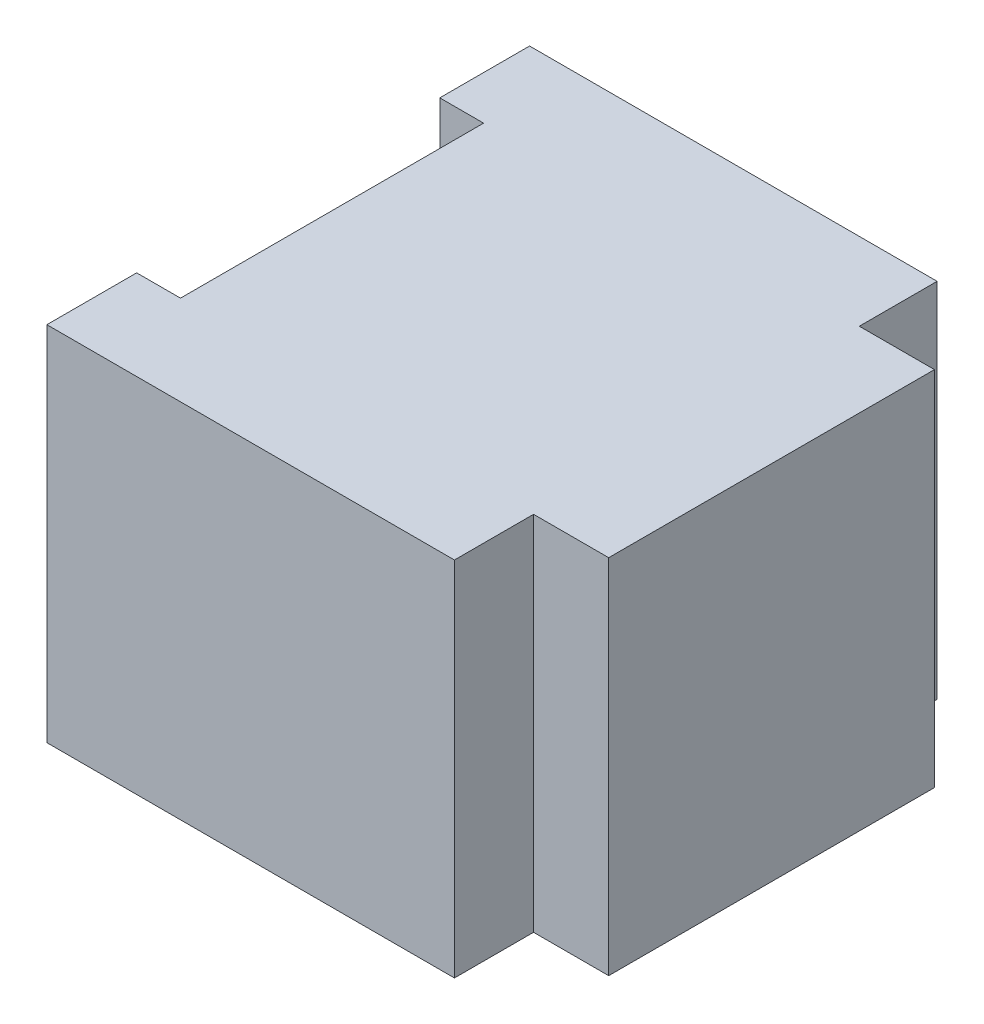
ISO-10303-21;
HEADER;
FILE_DESCRIPTION(('STEP AP214'),'2;1');
FILE_NAME('part.step','',(''),(''),'','','');
FILE_SCHEMA(('AUTOMOTIVE_DESIGN { 1 0 10303 214 1 1 1 1 }'));
ENDSEC;
DATA;
#1=APPLICATION_CONTEXT('core data for automotive mechanical design processes');
#2=APPLICATION_PROTOCOL_DEFINITION('international standard','automotive_design',2000,#1);
#3=PRODUCT_CONTEXT('',#1,'mechanical');
#4=PRODUCT('Part','Part','',(#3));
#5=PRODUCT_RELATED_PRODUCT_CATEGORY('part','',(#4));
#6=PRODUCT_DEFINITION_FORMATION('','',#4);
#7=PRODUCT_DEFINITION_CONTEXT('part definition',#1,'design');
#8=PRODUCT_DEFINITION('design','',#6,#7);
#9=PRODUCT_DEFINITION_SHAPE('','',#8);
#10=(LENGTH_UNIT() NAMED_UNIT(*) SI_UNIT(.MILLI.,.METRE.));
#11=(NAMED_UNIT(*) PLANE_ANGLE_UNIT() SI_UNIT($,.RADIAN.));
#12=(NAMED_UNIT(*) SI_UNIT($,.STERADIAN.) SOLID_ANGLE_UNIT());
#13=UNCERTAINTY_MEASURE_WITH_UNIT(LENGTH_MEASURE(1.E-05),#10,'distance_accuracy_value','');
#14=(GEOMETRIC_REPRESENTATION_CONTEXT(3) GLOBAL_UNCERTAINTY_ASSIGNED_CONTEXT((#13)) GLOBAL_UNIT_ASSIGNED_CONTEXT((#10,
#11,#12)) REPRESENTATION_CONTEXT('',''));
#15=CARTESIAN_POINT('',(0.,0.,0.));
#16=DIRECTION('',(0.,0.,1.));
#17=DIRECTION('',(1.,0.,0.));
#18=AXIS2_PLACEMENT_3D('',#15,#16,#17);
#19=CARTESIAN_POINT('',(-40.,60.,40.));
#20=DIRECTION('',(1.,0.,0.));
#21=DIRECTION('',(0.,0.,-1.));
#22=AXIS2_PLACEMENT_3D('',#19,#20,#21);
#23=PLANE('',#22);
#24=DIRECTION('',(0.,0.,1.));
#25=VECTOR('',#24,1.);
#26=CARTESIAN_POINT('',(-40.,0.,40.));
#27=LINE('',#26,#25);
#28=CARTESIAN_POINT('',(-40.,0.,-40.));
#29=VERTEX_POINT('',#28);
#30=CARTESIAN_POINT('',(-40.,0.,-25.1186473822366));
#31=VERTEX_POINT('',#30);
#32=EDGE_CURVE('E143',#29,#31,#27,.T.);
#33=ORIENTED_EDGE('',*,*,#32,.T.);
#34=DIRECTION('',(0.,1.,0.));
#35=VECTOR('',#34,1.);
#36=CARTESIAN_POINT('',(-40.,0.,-25.1186473822366));
#37=LINE('',#36,#35);
#38=CARTESIAN_POINT('',(-40.,60.,-25.1186473822366));
#39=VERTEX_POINT('',#38);
#40=EDGE_CURVE('E149',#31,#39,#37,.T.);
#41=ORIENTED_EDGE('',*,*,#40,.T.);
#42=DIRECTION('',(0.,0.,1.));
#43=VECTOR('',#42,1.);
#44=CARTESIAN_POINT('',(-40.,60.,40.));
#45=LINE('',#44,#43);
#46=CARTESIAN_POINT('',(-40.,60.,-40.));
#47=VERTEX_POINT('',#46);
#48=EDGE_CURVE('E163',#47,#39,#45,.T.);
#49=ORIENTED_EDGE('',*,*,#48,.F.);
#50=DIRECTION('',(0.,-1.,0.));
#51=VECTOR('',#50,1.);
#52=CARTESIAN_POINT('',(-40.,60.,-40.));
#53=LINE('',#52,#51);
#54=EDGE_CURVE('E11',#47,#29,#53,.T.);
#55=ORIENTED_EDGE('',*,*,#54,.T.);
#56=EDGE_LOOP('',(#33,#41,#49,#55));
#57=FACE_BOUND('',#56,.T.);
#58=ADVANCED_FACE('F33',(#57),#23,.F.);
#59=CARTESIAN_POINT('',(40.,60.,40.));
#60=DIRECTION('',(-1.,0.,0.));
#61=DIRECTION('',(0.,0.,1.));
#62=AXIS2_PLACEMENT_3D('',#59,#60,#61);
#63=PLANE('',#62);
#64=DIRECTION('',(0.,0.,-1.));
#65=VECTOR('',#64,1.);
#66=CARTESIAN_POINT('',(40.,0.,40.));
#67=LINE('',#66,#65);
#68=CARTESIAN_POINT('',(40.,0.,26.8852335717561));
#69=VERTEX_POINT('',#68);
#70=CARTESIAN_POINT('',(40.,0.,-27.1060568454465));
#71=VERTEX_POINT('',#70);
#72=EDGE_CURVE('E145',#69,#71,#67,.T.);
#73=ORIENTED_EDGE('',*,*,#72,.T.);
#74=DIRECTION('',(0.,1.,0.));
#75=VECTOR('',#74,1.);
#76=CARTESIAN_POINT('',(40.,0.,-27.1060568454465));
#77=LINE('',#76,#75);
#78=CARTESIAN_POINT('',(40.,60.,-27.1060568454465));
#79=VERTEX_POINT('',#78);
#80=EDGE_CURVE('E191',#71,#79,#77,.T.);
#81=ORIENTED_EDGE('',*,*,#80,.T.);
#82=DIRECTION('',(0.,0.,-1.));
#83=VECTOR('',#82,1.);
#84=CARTESIAN_POINT('',(40.,60.,40.));
#85=LINE('',#84,#83);
#86=CARTESIAN_POINT('',(40.,60.,26.8852335717561));
#87=VERTEX_POINT('',#86);
#88=EDGE_CURVE('E155',#87,#79,#85,.T.);
#89=ORIENTED_EDGE('',*,*,#88,.F.);
#90=DIRECTION('',(0.,1.,0.));
#91=VECTOR('',#90,1.);
#92=CARTESIAN_POINT('',(40.,0.,26.8852335717561));
#93=LINE('',#92,#91);
#94=EDGE_CURVE('E198',#69,#87,#93,.T.);
#95=ORIENTED_EDGE('',*,*,#94,.F.);
#96=EDGE_LOOP('',(#73,#81,#89,#95));
#97=FACE_BOUND('',#96,.T.);
#98=ADVANCED_FACE('F35',(#97),#63,.F.);
#99=CARTESIAN_POINT('',(-40.,60.,-40.));
#100=DIRECTION('',(0.,0.,1.));
#101=DIRECTION('',(1.,0.,0.));
#102=AXIS2_PLACEMENT_3D('',#99,#100,#101);
#103=PLANE('',#102);
#104=DIRECTION('',(-1.,0.,0.));
#105=VECTOR('',#104,1.);
#106=CARTESIAN_POINT('',(-40.,60.,-40.));
#107=LINE('',#106,#105);
#108=CARTESIAN_POINT('',(27.5477033928263,60.,-40.));
#109=VERTEX_POINT('',#108);
#110=EDGE_CURVE('E137',#109,#47,#107,.T.);
#111=ORIENTED_EDGE('',*,*,#110,.F.);
#112=DIRECTION('',(0.,1.,0.));
#113=VECTOR('',#112,1.);
#114=CARTESIAN_POINT('',(27.5477033928263,0.,-40.));
#115=LINE('',#114,#113);
#116=CARTESIAN_POINT('',(27.5477033928263,0.,-40.));
#117=VERTEX_POINT('',#116);
#118=EDGE_CURVE('E125',#117,#109,#115,.T.);
#119=ORIENTED_EDGE('',*,*,#118,.F.);
#120=DIRECTION('',(-1.,0.,0.));
#121=VECTOR('',#120,1.);
#122=CARTESIAN_POINT('',(-40.,0.,-40.));
#123=LINE('',#122,#121);
#124=EDGE_CURVE('E136',#117,#29,#123,.T.);
#125=ORIENTED_EDGE('',*,*,#124,.T.);
#126=ORIENTED_EDGE('',*,*,#54,.F.);
#127=EDGE_LOOP('',(#111,#119,#125,#126));
#128=FACE_BOUND('',#127,.T.);
#129=ADVANCED_FACE('F134',(#128),#103,.F.);
#130=CARTESIAN_POINT('',(-40.,60.,25.1186473822362));
#131=VERTEX_POINT('',#130);
#132=CARTESIAN_POINT('',(-40.,60.,40.));
#133=VERTEX_POINT('',#132);
#134=EDGE_CURVE('E167',#131,#133,#45,.T.);
#135=ORIENTED_EDGE('',*,*,#134,.F.);
#136=DIRECTION('',(0.,1.,0.));
#137=VECTOR('',#136,1.);
#138=CARTESIAN_POINT('',(-40.,0.,25.1186473822362));
#139=LINE('',#138,#137);
#140=CARTESIAN_POINT('',(-40.,0.,25.1186473822362));
#141=VERTEX_POINT('',#140);
#142=EDGE_CURVE('E173',#141,#131,#139,.T.);
#143=ORIENTED_EDGE('',*,*,#142,.F.);
#144=CARTESIAN_POINT('',(-40.,0.,40.));
#145=VERTEX_POINT('',#144);
#146=EDGE_CURVE('E144',#141,#145,#27,.T.);
#147=ORIENTED_EDGE('',*,*,#146,.T.);
#148=DIRECTION('',(0.,-1.,0.));
#149=VECTOR('',#148,1.);
#150=CARTESIAN_POINT('',(-40.,60.,40.));
#151=LINE('',#150,#149);
#152=EDGE_CURVE('E41',#133,#145,#151,.T.);
#153=ORIENTED_EDGE('',*,*,#152,.F.);
#154=EDGE_LOOP('',(#135,#143,#147,#153));
#155=FACE_BOUND('',#154,.T.);
#156=ADVANCED_FACE('F235',(#155),#23,.F.);
#157=CARTESIAN_POINT('',(-40.,60.,40.));
#158=DIRECTION('',(0.,0.,-1.));
#159=DIRECTION('',(-1.,0.,0.));
#160=AXIS2_PLACEMENT_3D('',#157,#158,#159);
#161=PLANE('',#160);
#162=DIRECTION('',(1.,0.,0.));
#163=VECTOR('',#162,1.);
#164=CARTESIAN_POINT('',(-40.,0.,40.));
#165=LINE('',#164,#163);
#166=CARTESIAN_POINT('',(27.5477033928263,0.,40.));
#167=VERTEX_POINT('',#166);
#168=EDGE_CURVE('E153',#145,#167,#165,.T.);
#169=ORIENTED_EDGE('',*,*,#168,.T.);
#170=DIRECTION('',(0.,1.,0.));
#171=VECTOR('',#170,1.);
#172=CARTESIAN_POINT('',(27.5477033928263,0.,40.));
#173=LINE('',#172,#171);
#174=CARTESIAN_POINT('',(27.5477033928263,60.,40.));
#175=VERTEX_POINT('',#174);
#176=EDGE_CURVE('E202',#167,#175,#173,.T.);
#177=ORIENTED_EDGE('',*,*,#176,.T.);
#178=DIRECTION('',(1.,0.,0.));
#179=VECTOR('',#178,1.);
#180=CARTESIAN_POINT('',(-40.,60.,40.));
#181=LINE('',#180,#179);
#182=EDGE_CURVE('E157',#133,#175,#181,.T.);
#183=ORIENTED_EDGE('',*,*,#182,.F.);
#184=ORIENTED_EDGE('',*,*,#152,.T.);
#185=EDGE_LOOP('',(#169,#177,#183,#184));
#186=FACE_BOUND('',#185,.T.);
#187=ADVANCED_FACE('F230',(#186),#161,.F.);
#188=CARTESIAN_POINT('',(0.,60.,0.));
#189=DIRECTION('',(0.,-1.,0.));
#190=DIRECTION('',(0.,0.,-1.));
#191=AXIS2_PLACEMENT_3D('',#188,#189,#190);
#192=PLANE('',#191);
#193=ORIENTED_EDGE('',*,*,#88,.T.);
#194=DIRECTION('',(1.,0.,0.));
#195=VECTOR('',#194,1.);
#196=CARTESIAN_POINT('',(40.,60.,-27.1060568454465));
#197=LINE('',#196,#195);
#198=CARTESIAN_POINT('',(27.5477033928263,60.,-27.1060568454465));
#199=VERTEX_POINT('',#198);
#200=EDGE_CURVE('E130',#199,#79,#197,.T.);
#201=ORIENTED_EDGE('',*,*,#200,.F.);
#202=DIRECTION('',(0.,0.,1.));
#203=VECTOR('',#202,1.);
#204=CARTESIAN_POINT('',(27.5477033928263,60.,-40.));
#205=LINE('',#204,#203);
#206=EDGE_CURVE('E205',#109,#199,#205,.T.);
#207=ORIENTED_EDGE('',*,*,#206,.F.);
#208=ORIENTED_EDGE('',*,*,#110,.T.);
#209=ORIENTED_EDGE('',*,*,#48,.T.);
#210=DIRECTION('',(-1.,0.,0.));
#211=VECTOR('',#210,1.);
#212=CARTESIAN_POINT('',(-40.,60.,-25.1186473822366));
#213=LINE('',#212,#211);
#214=CARTESIAN_POINT('',(-32.737050324541,60.,-25.1186473822366));
#215=VERTEX_POINT('',#214);
#216=EDGE_CURVE('E182',#215,#39,#213,.T.);
#217=ORIENTED_EDGE('',*,*,#216,.F.);
#218=DIRECTION('',(0.,0.,-1.));
#219=VECTOR('',#218,1.);
#220=CARTESIAN_POINT('',(-32.737050324541,60.,-25.1186473822366));
#221=LINE('',#220,#219);
#222=CARTESIAN_POINT('',(-32.737050324541,60.,25.1186473822362));
#223=VERTEX_POINT('',#222);
#224=EDGE_CURVE('E185',#223,#215,#221,.T.);
#225=ORIENTED_EDGE('',*,*,#224,.F.);
#226=DIRECTION('',(1.,0.,0.));
#227=VECTOR('',#226,1.);
#228=CARTESIAN_POINT('',(-40.,60.,25.1186473822362));
#229=LINE('',#228,#227);
#230=EDGE_CURVE('E188',#131,#223,#229,.T.);
#231=ORIENTED_EDGE('',*,*,#230,.F.);
#232=ORIENTED_EDGE('',*,*,#134,.T.);
#233=ORIENTED_EDGE('',*,*,#182,.T.);
#234=DIRECTION('',(0.,0.,1.));
#235=VECTOR('',#234,1.);
#236=CARTESIAN_POINT('',(27.5477033928263,60.,40.));
#237=LINE('',#236,#235);
#238=CARTESIAN_POINT('',(27.5477033928263,60.,26.8852335717561));
#239=VERTEX_POINT('',#238);
#240=EDGE_CURVE('E206',#239,#175,#237,.T.);
#241=ORIENTED_EDGE('',*,*,#240,.F.);
#242=DIRECTION('',(-1.,0.,0.));
#243=VECTOR('',#242,1.);
#244=CARTESIAN_POINT('',(40.,60.,26.8852335717561));
#245=LINE('',#244,#243);
#246=EDGE_CURVE('E209',#87,#239,#245,.T.);
#247=ORIENTED_EDGE('',*,*,#246,.F.);
#248=EDGE_LOOP('',(#193,#201,#207,#208,#209,#217,#225,#231,#232,#233,#241,#247));
#249=FACE_BOUND('',#248,.T.);
#250=ADVANCED_FACE('F227',(#249),#192,.F.);
#251=CARTESIAN_POINT('',(0.,0.,0.));
#252=DIRECTION('',(0.,-1.,0.));
#253=DIRECTION('',(0.,0.,-1.));
#254=AXIS2_PLACEMENT_3D('',#251,#252,#253);
#255=PLANE('',#254);
#256=DIRECTION('',(1.,0.,0.));
#257=VECTOR('',#256,1.);
#258=CARTESIAN_POINT('',(40.,0.,-27.1060568454465));
#259=LINE('',#258,#257);
#260=CARTESIAN_POINT('',(27.5477033928263,0.,-27.1060568454465));
#261=VERTEX_POINT('',#260);
#262=EDGE_CURVE('E48',#261,#71,#259,.T.);
#263=ORIENTED_EDGE('',*,*,#262,.T.);
#264=ORIENTED_EDGE('',*,*,#72,.F.);
#265=DIRECTION('',(-1.,0.,0.));
#266=VECTOR('',#265,1.);
#267=CARTESIAN_POINT('',(40.,0.,26.8852335717561));
#268=LINE('',#267,#266);
#269=CARTESIAN_POINT('',(27.5477033928263,0.,26.8852335717561));
#270=VERTEX_POINT('',#269);
#271=EDGE_CURVE('E208',#69,#270,#268,.T.);
#272=ORIENTED_EDGE('',*,*,#271,.T.);
#273=DIRECTION('',(0.,0.,1.));
#274=VECTOR('',#273,1.);
#275=CARTESIAN_POINT('',(27.5477033928263,0.,40.));
#276=LINE('',#275,#274);
#277=EDGE_CURVE('E56',#270,#167,#276,.T.);
#278=ORIENTED_EDGE('',*,*,#277,.T.);
#279=ORIENTED_EDGE('',*,*,#168,.F.);
#280=ORIENTED_EDGE('',*,*,#146,.F.);
#281=DIRECTION('',(1.,0.,0.));
#282=VECTOR('',#281,1.);
#283=CARTESIAN_POINT('',(-40.,0.,25.1186473822362));
#284=LINE('',#283,#282);
#285=CARTESIAN_POINT('',(-32.737050324541,0.,25.1186473822362));
#286=VERTEX_POINT('',#285);
#287=EDGE_CURVE('E184',#141,#286,#284,.T.);
#288=ORIENTED_EDGE('',*,*,#287,.T.);
#289=DIRECTION('',(0.,0.,-1.));
#290=VECTOR('',#289,1.);
#291=CARTESIAN_POINT('',(-32.737050324541,0.,-25.1186473822366));
#292=LINE('',#291,#290);
#293=CARTESIAN_POINT('',(-32.737050324541,0.,-25.1186473822366));
#294=VERTEX_POINT('',#293);
#295=EDGE_CURVE('E193',#286,#294,#292,.T.);
#296=ORIENTED_EDGE('',*,*,#295,.T.);
#297=DIRECTION('',(-1.,0.,0.));
#298=VECTOR('',#297,1.);
#299=CARTESIAN_POINT('',(-40.,0.,-25.1186473822366));
#300=LINE('',#299,#298);
#301=EDGE_CURVE('E176',#294,#31,#300,.T.);
#302=ORIENTED_EDGE('',*,*,#301,.T.);
#303=ORIENTED_EDGE('',*,*,#32,.F.);
#304=ORIENTED_EDGE('',*,*,#124,.F.);
#305=DIRECTION('',(0.,0.,1.));
#306=VECTOR('',#305,1.);
#307=CARTESIAN_POINT('',(27.5477033928263,0.,-40.));
#308=LINE('',#307,#306);
#309=EDGE_CURVE('E121',#117,#261,#308,.T.);
#310=ORIENTED_EDGE('',*,*,#309,.T.);
#311=EDGE_LOOP('',(#263,#264,#272,#278,#279,#280,#288,#296,#302,#303,#304,#310));
#312=FACE_BOUND('',#311,.T.);
#313=ADVANCED_FACE('F140',(#312),#255,.T.);
#314=CARTESIAN_POINT('',(-40.,0.,-25.1186473822366));
#315=DIRECTION('',(0.,0.,-1.));
#316=DIRECTION('',(-1.,0.,0.));
#317=AXIS2_PLACEMENT_3D('',#314,#315,#316);
#318=PLANE('',#317);
#319=ORIENTED_EDGE('',*,*,#216,.T.);
#320=ORIENTED_EDGE('',*,*,#40,.F.);
#321=ORIENTED_EDGE('',*,*,#301,.F.);
#322=DIRECTION('',(0.,1.,0.));
#323=VECTOR('',#322,1.);
#324=CARTESIAN_POINT('',(-32.737050324541,0.,-25.1186473822366));
#325=LINE('',#324,#323);
#326=EDGE_CURVE('E178',#294,#215,#325,.T.);
#327=ORIENTED_EDGE('',*,*,#326,.T.);
#328=EDGE_LOOP('',(#319,#320,#321,#327));
#329=FACE_BOUND('',#328,.T.);
#330=ADVANCED_FACE('F294',(#329),#318,.F.);
#331=CARTESIAN_POINT('',(-32.737050324541,0.,-25.1186473822366));
#332=DIRECTION('',(1.,0.,0.));
#333=DIRECTION('',(0.,0.,-1.));
#334=AXIS2_PLACEMENT_3D('',#331,#332,#333);
#335=PLANE('',#334);
#336=ORIENTED_EDGE('',*,*,#224,.T.);
#337=ORIENTED_EDGE('',*,*,#326,.F.);
#338=ORIENTED_EDGE('',*,*,#295,.F.);
#339=DIRECTION('',(0.,1.,0.));
#340=VECTOR('',#339,1.);
#341=CARTESIAN_POINT('',(-32.737050324541,0.,25.1186473822362));
#342=LINE('',#341,#340);
#343=EDGE_CURVE('E175',#286,#223,#342,.T.);
#344=ORIENTED_EDGE('',*,*,#343,.T.);
#345=EDGE_LOOP('',(#336,#337,#338,#344));
#346=FACE_BOUND('',#345,.T.);
#347=ADVANCED_FACE('F243',(#346),#335,.F.);
#348=CARTESIAN_POINT('',(-40.,0.,25.1186473822362));
#349=DIRECTION('',(0.,0.,1.));
#350=DIRECTION('',(1.,0.,0.));
#351=AXIS2_PLACEMENT_3D('',#348,#349,#350);
#352=PLANE('',#351);
#353=ORIENTED_EDGE('',*,*,#230,.T.);
#354=ORIENTED_EDGE('',*,*,#343,.F.);
#355=ORIENTED_EDGE('',*,*,#287,.F.);
#356=ORIENTED_EDGE('',*,*,#142,.T.);
#357=EDGE_LOOP('',(#353,#354,#355,#356));
#358=FACE_BOUND('',#357,.T.);
#359=ADVANCED_FACE('F238',(#358),#352,.F.);
#360=CARTESIAN_POINT('',(27.5477033928263,0.,40.));
#361=DIRECTION('',(-1.,0.,0.));
#362=DIRECTION('',(0.,0.,1.));
#363=AXIS2_PLACEMENT_3D('',#360,#361,#362);
#364=PLANE('',#363);
#365=ORIENTED_EDGE('',*,*,#240,.T.);
#366=ORIENTED_EDGE('',*,*,#176,.F.);
#367=ORIENTED_EDGE('',*,*,#277,.F.);
#368=DIRECTION('',(0.,1.,0.));
#369=VECTOR('',#368,1.);
#370=CARTESIAN_POINT('',(27.5477033928263,0.,26.8852335717561));
#371=LINE('',#370,#369);
#372=EDGE_CURVE('E200',#270,#239,#371,.T.);
#373=ORIENTED_EDGE('',*,*,#372,.T.);
#374=EDGE_LOOP('',(#365,#366,#367,#373));
#375=FACE_BOUND('',#374,.T.);
#376=ADVANCED_FACE('F229',(#375),#364,.F.);
#377=CARTESIAN_POINT('',(40.,0.,26.8852335717561));
#378=DIRECTION('',(0.,0.,-1.));
#379=DIRECTION('',(-1.,0.,0.));
#380=AXIS2_PLACEMENT_3D('',#377,#378,#379);
#381=PLANE('',#380);
#382=ORIENTED_EDGE('',*,*,#246,.T.);
#383=ORIENTED_EDGE('',*,*,#372,.F.);
#384=ORIENTED_EDGE('',*,*,#271,.F.);
#385=ORIENTED_EDGE('',*,*,#94,.T.);
#386=EDGE_LOOP('',(#382,#383,#384,#385));
#387=FACE_BOUND('',#386,.T.);
#388=ADVANCED_FACE('F226',(#387),#381,.F.);
#389=CARTESIAN_POINT('',(40.,0.,-27.1060568454465));
#390=DIRECTION('',(0.,0.,1.));
#391=DIRECTION('',(1.,0.,0.));
#392=AXIS2_PLACEMENT_3D('',#389,#390,#391);
#393=PLANE('',#392);
#394=ORIENTED_EDGE('',*,*,#200,.T.);
#395=ORIENTED_EDGE('',*,*,#80,.F.);
#396=ORIENTED_EDGE('',*,*,#262,.F.);
#397=DIRECTION('',(0.,1.,0.));
#398=VECTOR('',#397,1.);
#399=CARTESIAN_POINT('',(27.5477033928263,0.,-27.1060568454465));
#400=LINE('',#399,#398);
#401=EDGE_CURVE('E127',#261,#199,#400,.T.);
#402=ORIENTED_EDGE('',*,*,#401,.T.);
#403=EDGE_LOOP('',(#394,#395,#396,#402));
#404=FACE_BOUND('',#403,.T.);
#405=ADVANCED_FACE('F248',(#404),#393,.F.);
#406=CARTESIAN_POINT('',(27.5477033928263,0.,-40.));
#407=DIRECTION('',(-1.,0.,0.));
#408=DIRECTION('',(0.,0.,1.));
#409=AXIS2_PLACEMENT_3D('',#406,#407,#408);
#410=PLANE('',#409);
#411=ORIENTED_EDGE('',*,*,#206,.T.);
#412=ORIENTED_EDGE('',*,*,#401,.F.);
#413=ORIENTED_EDGE('',*,*,#309,.F.);
#414=ORIENTED_EDGE('',*,*,#118,.T.);
#415=EDGE_LOOP('',(#411,#412,#413,#414));
#416=FACE_BOUND('',#415,.T.);
#417=ADVANCED_FACE('F124',(#416),#410,.F.);
#418=CLOSED_SHELL('',(#58,#98,#129,#156,#187,#250,#313,#330,#347,#359,#376,#388,#405,#417));
#419=MANIFOLD_SOLID_BREP('B2',#418);
#420=ADVANCED_BREP_SHAPE_REPRESENTATION('',(#18,#419),#14);
#421=SHAPE_DEFINITION_REPRESENTATION(#9,#420);
ENDSEC;
END-ISO-10303-21;
